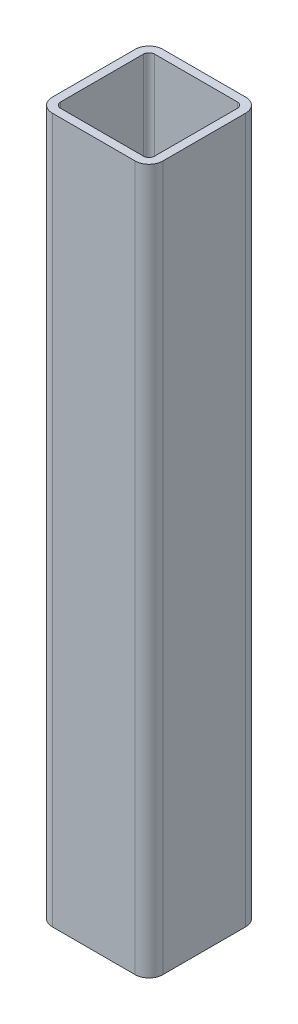
ISO-10303-21;
HEADER;
FILE_DESCRIPTION(('STEP AP214'),'2;1');
FILE_NAME('part.step','',(''),(''),'','','');
FILE_SCHEMA(('AUTOMOTIVE_DESIGN { 1 0 10303 214 1 1 1 1 }'));
ENDSEC;
DATA;
#1=APPLICATION_CONTEXT('core data for automotive mechanical design processes');
#2=APPLICATION_PROTOCOL_DEFINITION('international standard','automotive_design',2000,#1);
#3=PRODUCT_CONTEXT('',#1,'mechanical');
#4=PRODUCT('Part','Part','',(#3));
#5=PRODUCT_RELATED_PRODUCT_CATEGORY('part','',(#4));
#6=PRODUCT_DEFINITION_FORMATION('','',#4);
#7=PRODUCT_DEFINITION_CONTEXT('part definition',#1,'design');
#8=PRODUCT_DEFINITION('design','',#6,#7);
#9=PRODUCT_DEFINITION_SHAPE('','',#8);
#10=(LENGTH_UNIT() NAMED_UNIT(*) SI_UNIT(.MILLI.,.METRE.));
#11=(NAMED_UNIT(*) PLANE_ANGLE_UNIT() SI_UNIT($,.RADIAN.));
#12=(NAMED_UNIT(*) SI_UNIT($,.STERADIAN.) SOLID_ANGLE_UNIT());
#13=UNCERTAINTY_MEASURE_WITH_UNIT(LENGTH_MEASURE(1.E-05),#10,'distance_accuracy_value','');
#14=(GEOMETRIC_REPRESENTATION_CONTEXT(3) GLOBAL_UNCERTAINTY_ASSIGNED_CONTEXT((#13)) GLOBAL_UNIT_ASSIGNED_CONTEXT((#10,
#11,#12)) REPRESENTATION_CONTEXT('',''));
#15=CARTESIAN_POINT('',(0.,0.,0.));
#16=DIRECTION('',(0.,0.,1.));
#17=DIRECTION('',(1.,0.,0.));
#18=AXIS2_PLACEMENT_3D('',#15,#16,#17);
#19=CARTESIAN_POINT('',(-15.,127.5,15.));
#20=DIRECTION('',(0.,1.,0.));
#21=DIRECTION('',(0.,0.,1.));
#22=AXIS2_PLACEMENT_3D('',#19,#20,#21);
#23=PLANE('',#22);
#24=CARTESIAN_POINT('',(-15.,127.5,15.));
#25=DIRECTION('',(0.,1.,0.));
#26=DIRECTION('',(0.,0.,1.));
#27=AXIS2_PLACEMENT_3D('',#24,#25,#26);
#28=CIRCLE('',#27,5.);
#29=CARTESIAN_POINT('',(-20.,127.5,15.));
#30=VERTEX_POINT('',#29);
#31=CARTESIAN_POINT('',(-15.,127.5,20.));
#32=VERTEX_POINT('',#31);
#33=EDGE_CURVE('E259',#30,#32,#28,.T.);
#34=ORIENTED_EDGE('',*,*,#33,.T.);
#35=DIRECTION('',(1.,0.,0.));
#36=VECTOR('',#35,1.);
#37=CARTESIAN_POINT('',(-15.,127.5,20.));
#38=LINE('',#37,#36);
#39=CARTESIAN_POINT('',(15.,127.5,20.));
#40=VERTEX_POINT('',#39);
#41=EDGE_CURVE('E262',#32,#40,#38,.T.);
#42=ORIENTED_EDGE('',*,*,#41,.T.);
#43=CARTESIAN_POINT('',(15.,127.5,15.));
#44=DIRECTION('',(0.,1.,0.));
#45=DIRECTION('',(0.,0.,1.));
#46=AXIS2_PLACEMENT_3D('',#43,#44,#45);
#47=CIRCLE('',#46,5.);
#48=CARTESIAN_POINT('',(20.,127.5,15.));
#49=VERTEX_POINT('',#48);
#50=EDGE_CURVE('E265',#40,#49,#47,.T.);
#51=ORIENTED_EDGE('',*,*,#50,.T.);
#52=DIRECTION('',(0.,0.,-1.));
#53=VECTOR('',#52,1.);
#54=CARTESIAN_POINT('',(20.,127.5,15.));
#55=LINE('',#54,#53);
#56=CARTESIAN_POINT('',(20.,127.5,-15.));
#57=VERTEX_POINT('',#56);
#58=EDGE_CURVE('E267',#49,#57,#55,.T.);
#59=ORIENTED_EDGE('',*,*,#58,.T.);
#60=CARTESIAN_POINT('',(15.,127.5,-15.));
#61=DIRECTION('',(0.,1.,0.));
#62=DIRECTION('',(0.,0.,1.));
#63=AXIS2_PLACEMENT_3D('',#60,#61,#62);
#64=CIRCLE('',#63,5.);
#65=CARTESIAN_POINT('',(15.,127.5,-20.));
#66=VERTEX_POINT('',#65);
#67=EDGE_CURVE('E269',#57,#66,#64,.T.);
#68=ORIENTED_EDGE('',*,*,#67,.T.);
#69=DIRECTION('',(-1.,0.,0.));
#70=VECTOR('',#69,1.);
#71=CARTESIAN_POINT('',(-15.,127.5,-20.));
#72=LINE('',#71,#70);
#73=CARTESIAN_POINT('',(-15.,127.5,-20.));
#74=VERTEX_POINT('',#73);
#75=EDGE_CURVE('E271',#66,#74,#72,.T.);
#76=ORIENTED_EDGE('',*,*,#75,.T.);
#77=CARTESIAN_POINT('',(-15.,127.5,-15.));
#78=DIRECTION('',(0.,1.,0.));
#79=DIRECTION('',(0.,0.,1.));
#80=AXIS2_PLACEMENT_3D('',#77,#78,#79);
#81=CIRCLE('',#80,5.);
#82=CARTESIAN_POINT('',(-20.,127.5,-15.));
#83=VERTEX_POINT('',#82);
#84=EDGE_CURVE('E273',#74,#83,#81,.T.);
#85=ORIENTED_EDGE('',*,*,#84,.T.);
#86=DIRECTION('',(0.,0.,1.));
#87=VECTOR('',#86,1.);
#88=CARTESIAN_POINT('',(-20.,127.5,15.));
#89=LINE('',#88,#87);
#90=EDGE_CURVE('E275',#83,#30,#89,.T.);
#91=ORIENTED_EDGE('',*,*,#90,.T.);
#92=EDGE_LOOP('',(#34,#42,#51,#59,#68,#76,#85,#91));
#93=FACE_BOUND('',#92,.T.);
#94=DIRECTION('',(1.,0.,0.));
#95=VECTOR('',#94,1.);
#96=CARTESIAN_POINT('',(-15.,127.5,17.));
#97=LINE('',#96,#95);
#98=CARTESIAN_POINT('',(-15.,127.5,17.));
#99=VERTEX_POINT('',#98);
#100=CARTESIAN_POINT('',(15.,127.5,17.));
#101=VERTEX_POINT('',#100);
#102=EDGE_CURVE('E202',#99,#101,#97,.T.);
#103=ORIENTED_EDGE('',*,*,#102,.F.);
#104=CARTESIAN_POINT('',(-15.,127.5,15.));
#105=DIRECTION('',(0.,1.,0.));
#106=DIRECTION('',(1.,0.,0.));
#107=AXIS2_PLACEMENT_3D('',#104,#105,#106);
#108=CIRCLE('',#107,2.);
#109=CARTESIAN_POINT('',(-17.,127.5,15.));
#110=VERTEX_POINT('',#109);
#111=EDGE_CURVE('E194',#110,#99,#108,.T.);
#112=ORIENTED_EDGE('',*,*,#111,.F.);
#113=DIRECTION('',(0.,0.,1.));
#114=VECTOR('',#113,1.);
#115=CARTESIAN_POINT('',(-17.,127.5,15.));
#116=LINE('',#115,#114);
#117=CARTESIAN_POINT('',(-17.,127.5,-15.));
#118=VERTEX_POINT('',#117);
#119=EDGE_CURVE('E227',#118,#110,#116,.T.);
#120=ORIENTED_EDGE('',*,*,#119,.F.);
#121=CARTESIAN_POINT('',(-15.,127.5,-15.));
#122=DIRECTION('',(0.,1.,0.));
#123=DIRECTION('',(1.,0.,0.));
#124=AXIS2_PLACEMENT_3D('',#121,#122,#123);
#125=CIRCLE('',#124,2.);
#126=CARTESIAN_POINT('',(-15.,127.5,-17.));
#127=VERTEX_POINT('',#126);
#128=EDGE_CURVE('E225',#127,#118,#125,.T.);
#129=ORIENTED_EDGE('',*,*,#128,.F.);
#130=DIRECTION('',(-1.,0.,0.));
#131=VECTOR('',#130,1.);
#132=CARTESIAN_POINT('',(-15.,127.5,-17.));
#133=LINE('',#132,#131);
#134=CARTESIAN_POINT('',(15.,127.5,-17.));
#135=VERTEX_POINT('',#134);
#136=EDGE_CURVE('E223',#135,#127,#133,.T.);
#137=ORIENTED_EDGE('',*,*,#136,.F.);
#138=CARTESIAN_POINT('',(15.,127.5,-15.));
#139=DIRECTION('',(0.,1.,0.));
#140=DIRECTION('',(1.,0.,0.));
#141=AXIS2_PLACEMENT_3D('',#138,#139,#140);
#142=CIRCLE('',#141,2.);
#143=CARTESIAN_POINT('',(17.,127.5,-15.));
#144=VERTEX_POINT('',#143);
#145=EDGE_CURVE('E221',#144,#135,#142,.T.);
#146=ORIENTED_EDGE('',*,*,#145,.F.);
#147=DIRECTION('',(0.,0.,-1.));
#148=VECTOR('',#147,1.);
#149=CARTESIAN_POINT('',(17.,127.5,15.));
#150=LINE('',#149,#148);
#151=CARTESIAN_POINT('',(17.,127.5,15.));
#152=VERTEX_POINT('',#151);
#153=EDGE_CURVE('E217',#152,#144,#150,.T.);
#154=ORIENTED_EDGE('',*,*,#153,.F.);
#155=CARTESIAN_POINT('',(15.,127.5,15.));
#156=DIRECTION('',(0.,1.,0.));
#157=DIRECTION('',(1.,0.,0.));
#158=AXIS2_PLACEMENT_3D('',#155,#156,#157);
#159=CIRCLE('',#158,2.);
#160=EDGE_CURVE('E215',#101,#152,#159,.T.);
#161=ORIENTED_EDGE('',*,*,#160,.F.);
#162=EDGE_LOOP('',(#103,#112,#120,#129,#137,#146,#154,#161));
#163=FACE_BOUND('',#162,.T.);
#164=ADVANCED_FACE('F81',(#93,#163),#23,.T.);
#165=CARTESIAN_POINT('',(-15.,-127.5,15.));
#166=DIRECTION('',(0.,1.,0.));
#167=DIRECTION('',(0.,0.,1.));
#168=AXIS2_PLACEMENT_3D('',#165,#166,#167);
#169=PLANE('',#168);
#170=CARTESIAN_POINT('',(-15.,-127.5,15.));
#171=DIRECTION('',(0.,1.,0.));
#172=DIRECTION('',(0.,0.,1.));
#173=AXIS2_PLACEMENT_3D('',#170,#171,#172);
#174=CIRCLE('',#173,5.);
#175=CARTESIAN_POINT('',(-20.,-127.5,15.));
#176=VERTEX_POINT('',#175);
#177=CARTESIAN_POINT('',(-15.,-127.5,20.));
#178=VERTEX_POINT('',#177);
#179=EDGE_CURVE('E210',#176,#178,#174,.T.);
#180=ORIENTED_EDGE('',*,*,#179,.F.);
#181=DIRECTION('',(0.,0.,1.));
#182=VECTOR('',#181,1.);
#183=CARTESIAN_POINT('',(-20.,-127.5,15.));
#184=LINE('',#183,#182);
#185=CARTESIAN_POINT('',(-20.,-127.5,-15.));
#186=VERTEX_POINT('',#185);
#187=EDGE_CURVE('E263',#186,#176,#184,.T.);
#188=ORIENTED_EDGE('',*,*,#187,.F.);
#189=CARTESIAN_POINT('',(-15.,-127.5,-15.));
#190=DIRECTION('',(0.,1.,0.));
#191=DIRECTION('',(0.,0.,1.));
#192=AXIS2_PLACEMENT_3D('',#189,#190,#191);
#193=CIRCLE('',#192,5.);
#194=CARTESIAN_POINT('',(-15.,-127.5,-20.));
#195=VERTEX_POINT('',#194);
#196=EDGE_CURVE('E290',#195,#186,#193,.T.);
#197=ORIENTED_EDGE('',*,*,#196,.F.);
#198=DIRECTION('',(-1.,0.,0.));
#199=VECTOR('',#198,1.);
#200=CARTESIAN_POINT('',(-15.,-127.5,-20.));
#201=LINE('',#200,#199);
#202=CARTESIAN_POINT('',(15.,-127.5,-20.));
#203=VERTEX_POINT('',#202);
#204=EDGE_CURVE('E288',#203,#195,#201,.T.);
#205=ORIENTED_EDGE('',*,*,#204,.F.);
#206=CARTESIAN_POINT('',(15.,-127.5,-15.));
#207=DIRECTION('',(0.,1.,0.));
#208=DIRECTION('',(0.,0.,1.));
#209=AXIS2_PLACEMENT_3D('',#206,#207,#208);
#210=CIRCLE('',#209,5.);
#211=CARTESIAN_POINT('',(20.,-127.5,-15.));
#212=VERTEX_POINT('',#211);
#213=EDGE_CURVE('E286',#212,#203,#210,.T.);
#214=ORIENTED_EDGE('',*,*,#213,.F.);
#215=DIRECTION('',(0.,0.,-1.));
#216=VECTOR('',#215,1.);
#217=CARTESIAN_POINT('',(20.,-127.5,15.));
#218=LINE('',#217,#216);
#219=CARTESIAN_POINT('',(20.,-127.5,15.));
#220=VERTEX_POINT('',#219);
#221=EDGE_CURVE('E284',#220,#212,#218,.T.);
#222=ORIENTED_EDGE('',*,*,#221,.F.);
#223=CARTESIAN_POINT('',(15.,-127.5,15.));
#224=DIRECTION('',(0.,1.,0.));
#225=DIRECTION('',(0.,0.,1.));
#226=AXIS2_PLACEMENT_3D('',#223,#224,#225);
#227=CIRCLE('',#226,5.);
#228=CARTESIAN_POINT('',(15.,-127.5,20.));
#229=VERTEX_POINT('',#228);
#230=EDGE_CURVE('E282',#229,#220,#227,.T.);
#231=ORIENTED_EDGE('',*,*,#230,.F.);
#232=DIRECTION('',(1.,0.,0.));
#233=VECTOR('',#232,1.);
#234=CARTESIAN_POINT('',(-15.,-127.5,20.));
#235=LINE('',#234,#233);
#236=EDGE_CURVE('E280',#178,#229,#235,.T.);
#237=ORIENTED_EDGE('',*,*,#236,.F.);
#238=EDGE_LOOP('',(#180,#188,#197,#205,#214,#222,#231,#237));
#239=FACE_BOUND('',#238,.T.);
#240=CARTESIAN_POINT('',(-15.,-127.5,15.));
#241=DIRECTION('',(0.,1.,0.));
#242=DIRECTION('',(1.,0.,0.));
#243=AXIS2_PLACEMENT_3D('',#240,#241,#242);
#244=CIRCLE('',#243,2.);
#245=CARTESIAN_POINT('',(-17.,-127.5,15.));
#246=VERTEX_POINT('',#245);
#247=CARTESIAN_POINT('',(-15.,-127.5,17.));
#248=VERTEX_POINT('',#247);
#249=EDGE_CURVE('E104',#246,#248,#244,.T.);
#250=ORIENTED_EDGE('',*,*,#249,.T.);
#251=DIRECTION('',(1.,0.,0.));
#252=VECTOR('',#251,1.);
#253=CARTESIAN_POINT('',(-15.,-127.5,17.));
#254=LINE('',#253,#252);
#255=CARTESIAN_POINT('',(15.,-127.5,17.));
#256=VERTEX_POINT('',#255);
#257=EDGE_CURVE('E209',#248,#256,#254,.T.);
#258=ORIENTED_EDGE('',*,*,#257,.T.);
#259=CARTESIAN_POINT('',(15.,-127.5,15.));
#260=DIRECTION('',(0.,1.,0.));
#261=DIRECTION('',(1.,0.,0.));
#262=AXIS2_PLACEMENT_3D('',#259,#260,#261);
#263=CIRCLE('',#262,2.);
#264=CARTESIAN_POINT('',(17.,-127.5,15.));
#265=VERTEX_POINT('',#264);
#266=EDGE_CURVE('E231',#256,#265,#263,.T.);
#267=ORIENTED_EDGE('',*,*,#266,.T.);
#268=DIRECTION('',(0.,0.,-1.));
#269=VECTOR('',#268,1.);
#270=CARTESIAN_POINT('',(17.,-127.5,15.));
#271=LINE('',#270,#269);
#272=CARTESIAN_POINT('',(17.,-127.5,-15.));
#273=VERTEX_POINT('',#272);
#274=EDGE_CURVE('E234',#265,#273,#271,.T.);
#275=ORIENTED_EDGE('',*,*,#274,.T.);
#276=CARTESIAN_POINT('',(15.,-127.5,-15.));
#277=DIRECTION('',(0.,1.,0.));
#278=DIRECTION('',(1.,0.,0.));
#279=AXIS2_PLACEMENT_3D('',#276,#277,#278);
#280=CIRCLE('',#279,2.);
#281=CARTESIAN_POINT('',(15.,-127.5,-17.));
#282=VERTEX_POINT('',#281);
#283=EDGE_CURVE('E237',#273,#282,#280,.T.);
#284=ORIENTED_EDGE('',*,*,#283,.T.);
#285=DIRECTION('',(-1.,0.,0.));
#286=VECTOR('',#285,1.);
#287=CARTESIAN_POINT('',(-15.,-127.5,-17.));
#288=LINE('',#287,#286);
#289=CARTESIAN_POINT('',(-15.,-127.5,-17.));
#290=VERTEX_POINT('',#289);
#291=EDGE_CURVE('E240',#282,#290,#288,.T.);
#292=ORIENTED_EDGE('',*,*,#291,.T.);
#293=CARTESIAN_POINT('',(-15.,-127.5,-15.));
#294=DIRECTION('',(0.,1.,0.));
#295=DIRECTION('',(1.,0.,0.));
#296=AXIS2_PLACEMENT_3D('',#293,#294,#295);
#297=CIRCLE('',#296,2.);
#298=CARTESIAN_POINT('',(-17.,-127.5,-15.));
#299=VERTEX_POINT('',#298);
#300=EDGE_CURVE('E243',#290,#299,#297,.T.);
#301=ORIENTED_EDGE('',*,*,#300,.T.);
#302=DIRECTION('',(0.,0.,1.));
#303=VECTOR('',#302,1.);
#304=CARTESIAN_POINT('',(-17.,-127.5,15.));
#305=LINE('',#304,#303);
#306=EDGE_CURVE('E203',#299,#246,#305,.T.);
#307=ORIENTED_EDGE('',*,*,#306,.T.);
#308=EDGE_LOOP('',(#250,#258,#267,#275,#284,#292,#301,#307));
#309=FACE_BOUND('',#308,.T.);
#310=ADVANCED_FACE('F320',(#239,#309),#169,.F.);
#311=CARTESIAN_POINT('',(-15.,127.5,15.));
#312=DIRECTION('',(0.,-1.,0.));
#313=DIRECTION('',(0.,0.,-1.));
#314=AXIS2_PLACEMENT_3D('',#311,#312,#313);
#315=CYLINDRICAL_SURFACE('',#314,5.);
#316=ORIENTED_EDGE('',*,*,#179,.T.);
#317=DIRECTION('',(0.,-1.,0.));
#318=VECTOR('',#317,1.);
#319=CARTESIAN_POINT('',(-15.,127.5,20.));
#320=LINE('',#319,#318);
#321=EDGE_CURVE('E12',#32,#178,#320,.T.);
#322=ORIENTED_EDGE('',*,*,#321,.F.);
#323=ORIENTED_EDGE('',*,*,#33,.F.);
#324=DIRECTION('',(0.,-1.,0.));
#325=VECTOR('',#324,1.);
#326=CARTESIAN_POINT('',(-20.,127.5,15.));
#327=LINE('',#326,#325);
#328=EDGE_CURVE('E277',#30,#176,#327,.T.);
#329=ORIENTED_EDGE('',*,*,#328,.T.);
#330=EDGE_LOOP('',(#316,#322,#323,#329));
#331=FACE_BOUND('',#330,.T.);
#332=ADVANCED_FACE('F83',(#331),#315,.T.);
#333=CARTESIAN_POINT('',(-15.,127.5,20.));
#334=DIRECTION('',(0.,0.,-1.));
#335=DIRECTION('',(-1.,0.,0.));
#336=AXIS2_PLACEMENT_3D('',#333,#334,#335);
#337=PLANE('',#336);
#338=ORIENTED_EDGE('',*,*,#236,.T.);
#339=DIRECTION('',(0.,-1.,0.));
#340=VECTOR('',#339,1.);
#341=CARTESIAN_POINT('',(15.,127.5,20.));
#342=LINE('',#341,#340);
#343=EDGE_CURVE('E89',#40,#229,#342,.T.);
#344=ORIENTED_EDGE('',*,*,#343,.F.);
#345=ORIENTED_EDGE('',*,*,#41,.F.);
#346=ORIENTED_EDGE('',*,*,#321,.T.);
#347=EDGE_LOOP('',(#338,#344,#345,#346));
#348=FACE_BOUND('',#347,.T.);
#349=ADVANCED_FACE('F337',(#348),#337,.F.);
#350=CARTESIAN_POINT('',(15.,127.5,15.));
#351=DIRECTION('',(0.,-1.,0.));
#352=DIRECTION('',(0.,0.,-1.));
#353=AXIS2_PLACEMENT_3D('',#350,#351,#352);
#354=CYLINDRICAL_SURFACE('',#353,5.);
#355=ORIENTED_EDGE('',*,*,#230,.T.);
#356=DIRECTION('',(0.,-1.,0.));
#357=VECTOR('',#356,1.);
#358=CARTESIAN_POINT('',(20.,127.5,15.));
#359=LINE('',#358,#357);
#360=EDGE_CURVE('E307',#49,#220,#359,.T.);
#361=ORIENTED_EDGE('',*,*,#360,.F.);
#362=ORIENTED_EDGE('',*,*,#50,.F.);
#363=ORIENTED_EDGE('',*,*,#343,.T.);
#364=EDGE_LOOP('',(#355,#361,#362,#363));
#365=FACE_BOUND('',#364,.T.);
#366=ADVANCED_FACE('F314',(#365),#354,.T.);
#367=CARTESIAN_POINT('',(20.,127.5,15.));
#368=DIRECTION('',(-1.,0.,0.));
#369=DIRECTION('',(0.,0.,1.));
#370=AXIS2_PLACEMENT_3D('',#367,#368,#369);
#371=PLANE('',#370);
#372=ORIENTED_EDGE('',*,*,#221,.T.);
#373=DIRECTION('',(0.,-1.,0.));
#374=VECTOR('',#373,1.);
#375=CARTESIAN_POINT('',(20.,127.5,-15.));
#376=LINE('',#375,#374);
#377=EDGE_CURVE('E304',#57,#212,#376,.T.);
#378=ORIENTED_EDGE('',*,*,#377,.F.);
#379=ORIENTED_EDGE('',*,*,#58,.F.);
#380=ORIENTED_EDGE('',*,*,#360,.T.);
#381=EDGE_LOOP('',(#372,#378,#379,#380));
#382=FACE_BOUND('',#381,.T.);
#383=ADVANCED_FACE('F326',(#382),#371,.F.);
#384=CARTESIAN_POINT('',(15.,127.5,-15.));
#385=DIRECTION('',(0.,-1.,0.));
#386=DIRECTION('',(0.,0.,-1.));
#387=AXIS2_PLACEMENT_3D('',#384,#385,#386);
#388=CYLINDRICAL_SURFACE('',#387,5.);
#389=ORIENTED_EDGE('',*,*,#213,.T.);
#390=DIRECTION('',(0.,-1.,0.));
#391=VECTOR('',#390,1.);
#392=CARTESIAN_POINT('',(15.,127.5,-20.));
#393=LINE('',#392,#391);
#394=EDGE_CURVE('E301',#66,#203,#393,.T.);
#395=ORIENTED_EDGE('',*,*,#394,.F.);
#396=ORIENTED_EDGE('',*,*,#67,.F.);
#397=ORIENTED_EDGE('',*,*,#377,.T.);
#398=EDGE_LOOP('',(#389,#395,#396,#397));
#399=FACE_BOUND('',#398,.T.);
#400=ADVANCED_FACE('F330',(#399),#388,.T.);
#401=CARTESIAN_POINT('',(-15.,127.5,-20.));
#402=DIRECTION('',(0.,0.,1.));
#403=DIRECTION('',(1.,0.,0.));
#404=AXIS2_PLACEMENT_3D('',#401,#402,#403);
#405=PLANE('',#404);
#406=ORIENTED_EDGE('',*,*,#204,.T.);
#407=DIRECTION('',(0.,-1.,0.));
#408=VECTOR('',#407,1.);
#409=CARTESIAN_POINT('',(-15.,127.5,-20.));
#410=LINE('',#409,#408);
#411=EDGE_CURVE('E298',#74,#195,#410,.T.);
#412=ORIENTED_EDGE('',*,*,#411,.F.);
#413=ORIENTED_EDGE('',*,*,#75,.F.);
#414=ORIENTED_EDGE('',*,*,#394,.T.);
#415=EDGE_LOOP('',(#406,#412,#413,#414));
#416=FACE_BOUND('',#415,.T.);
#417=ADVANCED_FACE('F350',(#416),#405,.F.);
#418=CARTESIAN_POINT('',(-15.,127.5,-15.));
#419=DIRECTION('',(0.,-1.,0.));
#420=DIRECTION('',(0.,0.,-1.));
#421=AXIS2_PLACEMENT_3D('',#418,#419,#420);
#422=CYLINDRICAL_SURFACE('',#421,5.);
#423=ORIENTED_EDGE('',*,*,#196,.T.);
#424=DIRECTION('',(0.,-1.,0.));
#425=VECTOR('',#424,1.);
#426=CARTESIAN_POINT('',(-20.,127.5,-15.));
#427=LINE('',#426,#425);
#428=EDGE_CURVE('E295',#83,#186,#427,.T.);
#429=ORIENTED_EDGE('',*,*,#428,.F.);
#430=ORIENTED_EDGE('',*,*,#84,.F.);
#431=ORIENTED_EDGE('',*,*,#411,.T.);
#432=EDGE_LOOP('',(#423,#429,#430,#431));
#433=FACE_BOUND('',#432,.T.);
#434=ADVANCED_FACE('F348',(#433),#422,.T.);
#435=CARTESIAN_POINT('',(-20.,127.5,15.));
#436=DIRECTION('',(1.,0.,0.));
#437=DIRECTION('',(0.,0.,-1.));
#438=AXIS2_PLACEMENT_3D('',#435,#436,#437);
#439=PLANE('',#438);
#440=ORIENTED_EDGE('',*,*,#187,.T.);
#441=ORIENTED_EDGE('',*,*,#328,.F.);
#442=ORIENTED_EDGE('',*,*,#90,.F.);
#443=ORIENTED_EDGE('',*,*,#428,.T.);
#444=EDGE_LOOP('',(#440,#441,#442,#443));
#445=FACE_BOUND('',#444,.T.);
#446=ADVANCED_FACE('F343',(#445),#439,.F.);
#447=CARTESIAN_POINT('',(-15.,127.5,15.));
#448=DIRECTION('',(0.,-1.,0.));
#449=DIRECTION('',(0.,0.,-1.));
#450=AXIS2_PLACEMENT_3D('',#447,#448,#449);
#451=CYLINDRICAL_SURFACE('',#450,2.);
#452=ORIENTED_EDGE('',*,*,#249,.F.);
#453=DIRECTION('',(0.,-1.,0.));
#454=VECTOR('',#453,1.);
#455=CARTESIAN_POINT('',(-17.,127.5,15.));
#456=LINE('',#455,#454);
#457=EDGE_CURVE('E198',#110,#246,#456,.T.);
#458=ORIENTED_EDGE('',*,*,#457,.F.);
#459=ORIENTED_EDGE('',*,*,#111,.T.);
#460=DIRECTION('',(0.,-1.,0.));
#461=VECTOR('',#460,1.);
#462=CARTESIAN_POINT('',(-15.,127.5,17.));
#463=LINE('',#462,#461);
#464=EDGE_CURVE('E197',#99,#248,#463,.T.);
#465=ORIENTED_EDGE('',*,*,#464,.T.);
#466=EDGE_LOOP('',(#452,#458,#459,#465));
#467=FACE_BOUND('',#466,.T.);
#468=ADVANCED_FACE('F196',(#467),#451,.F.);
#469=CARTESIAN_POINT('',(-15.,127.5,17.));
#470=DIRECTION('',(0.,0.,-1.));
#471=DIRECTION('',(-1.,0.,0.));
#472=AXIS2_PLACEMENT_3D('',#469,#470,#471);
#473=PLANE('',#472);
#474=ORIENTED_EDGE('',*,*,#257,.F.);
#475=ORIENTED_EDGE('',*,*,#464,.F.);
#476=ORIENTED_EDGE('',*,*,#102,.T.);
#477=DIRECTION('',(0.,-1.,0.));
#478=VECTOR('',#477,1.);
#479=CARTESIAN_POINT('',(15.,127.5,17.));
#480=LINE('',#479,#478);
#481=EDGE_CURVE('E211',#101,#256,#480,.T.);
#482=ORIENTED_EDGE('',*,*,#481,.T.);
#483=EDGE_LOOP('',(#474,#475,#476,#482));
#484=FACE_BOUND('',#483,.T.);
#485=ADVANCED_FACE('F206',(#484),#473,.T.);
#486=CARTESIAN_POINT('',(15.,127.5,15.));
#487=DIRECTION('',(0.,-1.,0.));
#488=DIRECTION('',(0.,0.,-1.));
#489=AXIS2_PLACEMENT_3D('',#486,#487,#488);
#490=CYLINDRICAL_SURFACE('',#489,2.);
#491=ORIENTED_EDGE('',*,*,#266,.F.);
#492=ORIENTED_EDGE('',*,*,#481,.F.);
#493=ORIENTED_EDGE('',*,*,#160,.T.);
#494=DIRECTION('',(0.,-1.,0.));
#495=VECTOR('',#494,1.);
#496=CARTESIAN_POINT('',(17.,127.5,15.));
#497=LINE('',#496,#495);
#498=EDGE_CURVE('E256',#152,#265,#497,.T.);
#499=ORIENTED_EDGE('',*,*,#498,.T.);
#500=EDGE_LOOP('',(#491,#492,#493,#499));
#501=FACE_BOUND('',#500,.T.);
#502=ADVANCED_FACE('F375',(#501),#490,.F.);
#503=CARTESIAN_POINT('',(17.,127.5,15.));
#504=DIRECTION('',(-1.,0.,0.));
#505=DIRECTION('',(0.,0.,1.));
#506=AXIS2_PLACEMENT_3D('',#503,#504,#505);
#507=PLANE('',#506);
#508=ORIENTED_EDGE('',*,*,#274,.F.);
#509=ORIENTED_EDGE('',*,*,#498,.F.);
#510=ORIENTED_EDGE('',*,*,#153,.T.);
#511=DIRECTION('',(0.,-1.,0.));
#512=VECTOR('',#511,1.);
#513=CARTESIAN_POINT('',(17.,127.5,-15.));
#514=LINE('',#513,#512);
#515=EDGE_CURVE('E254',#144,#273,#514,.T.);
#516=ORIENTED_EDGE('',*,*,#515,.T.);
#517=EDGE_LOOP('',(#508,#509,#510,#516));
#518=FACE_BOUND('',#517,.T.);
#519=ADVANCED_FACE('F379',(#518),#507,.T.);
#520=CARTESIAN_POINT('',(15.,127.5,-15.));
#521=DIRECTION('',(0.,-1.,0.));
#522=DIRECTION('',(0.,0.,-1.));
#523=AXIS2_PLACEMENT_3D('',#520,#521,#522);
#524=CYLINDRICAL_SURFACE('',#523,2.);
#525=ORIENTED_EDGE('',*,*,#283,.F.);
#526=ORIENTED_EDGE('',*,*,#515,.F.);
#527=ORIENTED_EDGE('',*,*,#145,.T.);
#528=DIRECTION('',(0.,-1.,0.));
#529=VECTOR('',#528,1.);
#530=CARTESIAN_POINT('',(15.,127.5,-17.));
#531=LINE('',#530,#529);
#532=EDGE_CURVE('E252',#135,#282,#531,.T.);
#533=ORIENTED_EDGE('',*,*,#532,.T.);
#534=EDGE_LOOP('',(#525,#526,#527,#533));
#535=FACE_BOUND('',#534,.T.);
#536=ADVANCED_FACE('F385',(#535),#524,.F.);
#537=CARTESIAN_POINT('',(-15.,127.5,-17.));
#538=DIRECTION('',(0.,0.,1.));
#539=DIRECTION('',(1.,0.,0.));
#540=AXIS2_PLACEMENT_3D('',#537,#538,#539);
#541=PLANE('',#540);
#542=ORIENTED_EDGE('',*,*,#291,.F.);
#543=ORIENTED_EDGE('',*,*,#532,.F.);
#544=ORIENTED_EDGE('',*,*,#136,.T.);
#545=DIRECTION('',(0.,-1.,0.));
#546=VECTOR('',#545,1.);
#547=CARTESIAN_POINT('',(-15.,127.5,-17.));
#548=LINE('',#547,#546);
#549=EDGE_CURVE('E250',#127,#290,#548,.T.);
#550=ORIENTED_EDGE('',*,*,#549,.T.);
#551=EDGE_LOOP('',(#542,#543,#544,#550));
#552=FACE_BOUND('',#551,.T.);
#553=ADVANCED_FACE('F389',(#552),#541,.T.);
#554=CARTESIAN_POINT('',(-15.,127.5,-15.));
#555=DIRECTION('',(0.,-1.,0.));
#556=DIRECTION('',(0.,0.,-1.));
#557=AXIS2_PLACEMENT_3D('',#554,#555,#556);
#558=CYLINDRICAL_SURFACE('',#557,2.);
#559=ORIENTED_EDGE('',*,*,#300,.F.);
#560=ORIENTED_EDGE('',*,*,#549,.F.);
#561=ORIENTED_EDGE('',*,*,#128,.T.);
#562=DIRECTION('',(0.,-1.,0.));
#563=VECTOR('',#562,1.);
#564=CARTESIAN_POINT('',(-17.,127.5,-15.));
#565=LINE('',#564,#563);
#566=EDGE_CURVE('E96',#118,#299,#565,.T.);
#567=ORIENTED_EDGE('',*,*,#566,.T.);
#568=EDGE_LOOP('',(#559,#560,#561,#567));
#569=FACE_BOUND('',#568,.T.);
#570=ADVANCED_FACE('F393',(#569),#558,.F.);
#571=CARTESIAN_POINT('',(-17.,127.5,15.));
#572=DIRECTION('',(1.,0.,0.));
#573=DIRECTION('',(0.,0.,-1.));
#574=AXIS2_PLACEMENT_3D('',#571,#572,#573);
#575=PLANE('',#574);
#576=ORIENTED_EDGE('',*,*,#306,.F.);
#577=ORIENTED_EDGE('',*,*,#566,.F.);
#578=ORIENTED_EDGE('',*,*,#119,.T.);
#579=ORIENTED_EDGE('',*,*,#457,.T.);
#580=EDGE_LOOP('',(#576,#577,#578,#579));
#581=FACE_BOUND('',#580,.T.);
#582=ADVANCED_FACE('F397',(#581),#575,.T.);
#583=CLOSED_SHELL('',(#164,#310,#332,#349,#366,#383,#400,#417,#434,#446,#468,#485,#502,#519,
#536,#553,#570,#582));
#584=MANIFOLD_SOLID_BREP('B2',#583);
#585=ADVANCED_BREP_SHAPE_REPRESENTATION('',(#18,#584),#14);
#586=SHAPE_DEFINITION_REPRESENTATION(#9,#585);
ENDSEC;
END-ISO-10303-21;
